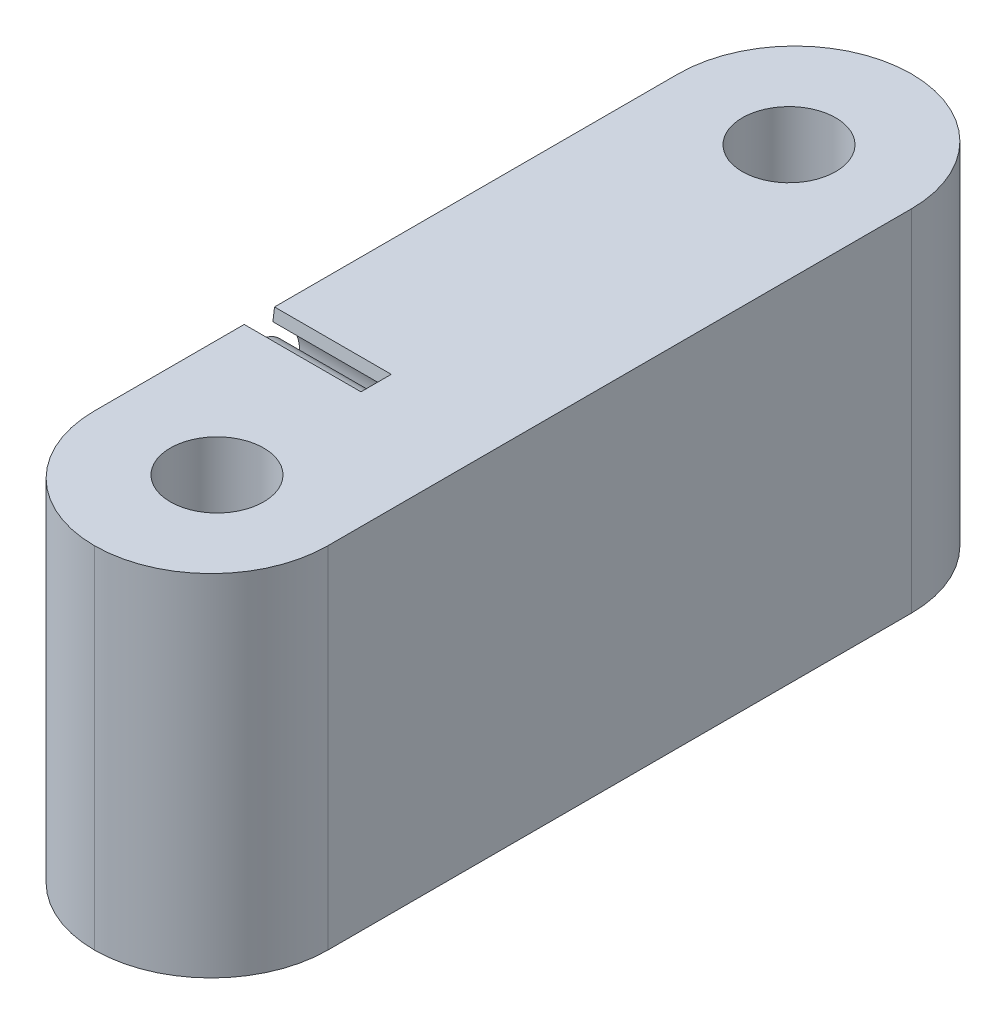
ISO-10303-21;
HEADER;
FILE_DESCRIPTION(('STEP AP214'),'2;1');
FILE_NAME('part.step','',(''),(''),'','','');
FILE_SCHEMA(('AUTOMOTIVE_DESIGN { 1 0 10303 214 1 1 1 1 }'));
ENDSEC;
DATA;
#1=APPLICATION_CONTEXT('core data for automotive mechanical design processes');
#2=APPLICATION_PROTOCOL_DEFINITION('international standard','automotive_design',2000,#1);
#3=PRODUCT_CONTEXT('',#1,'mechanical');
#4=PRODUCT('Part','Part','',(#3));
#5=PRODUCT_RELATED_PRODUCT_CATEGORY('part','',(#4));
#6=PRODUCT_DEFINITION_FORMATION('','',#4);
#7=PRODUCT_DEFINITION_CONTEXT('part definition',#1,'design');
#8=PRODUCT_DEFINITION('design','',#6,#7);
#9=PRODUCT_DEFINITION_SHAPE('','',#8);
#10=(LENGTH_UNIT() NAMED_UNIT(*) SI_UNIT(.MILLI.,.METRE.));
#11=(NAMED_UNIT(*) PLANE_ANGLE_UNIT() SI_UNIT($,.RADIAN.));
#12=(NAMED_UNIT(*) SI_UNIT($,.STERADIAN.) SOLID_ANGLE_UNIT());
#13=UNCERTAINTY_MEASURE_WITH_UNIT(LENGTH_MEASURE(1.E-05),#10,'distance_accuracy_value','');
#14=(GEOMETRIC_REPRESENTATION_CONTEXT(3) GLOBAL_UNCERTAINTY_ASSIGNED_CONTEXT((#13)) GLOBAL_UNIT_ASSIGNED_CONTEXT((#10,
#11,#12)) REPRESENTATION_CONTEXT('',''));
#15=CARTESIAN_POINT('',(0.,0.,0.));
#16=DIRECTION('',(0.,0.,1.));
#17=DIRECTION('',(1.,0.,0.));
#18=AXIS2_PLACEMENT_3D('',#15,#16,#17);
#19=CARTESIAN_POINT('',(-3.52238805970147,30.,-29.7611940298508));
#20=DIRECTION('',(1.,0.,0.));
#21=DIRECTION('',(0.,0.,-1.));
#22=AXIS2_PLACEMENT_3D('',#19,#20,#21);
#23=PLANE('',#22);
#24=DIRECTION('',(0.,0.,1.));
#25=VECTOR('',#24,1.);
#26=CARTESIAN_POINT('',(-3.52238805970147,30.,-29.7611940298508));
#27=LINE('',#26,#25);
#28=CARTESIAN_POINT('',(-3.52238805970147,30.,-19.7611940298507));
#29=VERTEX_POINT('',#28);
#30=CARTESIAN_POINT('',(-3.52238805970146,30.,14.812554190196));
#31=VERTEX_POINT('',#30);
#32=EDGE_CURVE('E196',#29,#31,#27,.T.);
#33=ORIENTED_EDGE('',*,*,#32,.F.);
#34=DIRECTION('',(0.,-1.,0.));
#35=VECTOR('',#34,1.);
#36=CARTESIAN_POINT('',(-3.52238805970147,30.,-19.7611940298507));
#37=LINE('',#36,#35);
#38=CARTESIAN_POINT('',(-3.52238805970147,0.,-19.7611940298507));
#39=VERTEX_POINT('',#38);
#40=EDGE_CURVE('E212',#29,#39,#37,.T.);
#41=ORIENTED_EDGE('',*,*,#40,.T.);
#42=DIRECTION('',(0.,0.,1.));
#43=VECTOR('',#42,1.);
#44=CARTESIAN_POINT('',(-3.52238805970147,0.,-29.7611940298508));
#45=LINE('',#44,#43);
#46=CARTESIAN_POINT('',(-3.52238805970146,0.,30.2388059701493));
#47=VERTEX_POINT('',#46);
#48=EDGE_CURVE('E184',#39,#47,#45,.T.);
#49=ORIENTED_EDGE('',*,*,#48,.T.);
#50=DIRECTION('',(0.,-1.,0.));
#51=VECTOR('',#50,1.);
#52=CARTESIAN_POINT('',(-3.52238805970146,30.,30.2388059701493));
#53=LINE('',#52,#51);
#54=CARTESIAN_POINT('',(-3.52238805970146,30.,30.2388059701493));
#55=VERTEX_POINT('',#54);
#56=EDGE_CURVE('E203',#47,#55,#53,.F.);
#57=ORIENTED_EDGE('',*,*,#56,.T.);
#58=CARTESIAN_POINT('',(-3.52238805970146,30.,17.4075983617578));
#59=VERTEX_POINT('',#58);
#60=EDGE_CURVE('E200',#59,#55,#27,.T.);
#61=ORIENTED_EDGE('',*,*,#60,.F.);
#62=DIRECTION('',(0.,-0.998274373174996,-0.0587220219514735));
#63=VECTOR('',#62,1.);
#64=CARTESIAN_POINT('',(-3.52238805970146,-0.916997145344465,15.5889514708551));
#65=LINE('',#64,#63);
#66=CARTESIAN_POINT('',(-3.52238805970146,28.9802150072761,17.3476110092446));
#67=VERTEX_POINT('',#66);
#68=EDGE_CURVE('E164',#59,#67,#65,.T.);
#69=ORIENTED_EDGE('',*,*,#68,.T.);
#70=CARTESIAN_POINT('',(-3.52238805970146,25.6865831727299,16.1635547021105));
#71=DIRECTION('',(-1.,0.,0.));
#72=DIRECTION('',(0.,0.,1.));
#73=AXIS2_PLACEMENT_3D('',#70,#71,#72);
#74=CIRCLE('',#73,3.5);
#75=CARTESIAN_POINT('',(-3.52238805970146,28.9694464253818,14.9499613334784));
#76=VERTEX_POINT('',#75);
#77=EDGE_CURVE('E160',#76,#67,#74,.T.);
#78=ORIENTED_EDGE('',*,*,#77,.F.);
#79=DIRECTION('',(0.,0.991227900682634,-0.132163720091024));
#80=VECTOR('',#79,1.);
#81=CARTESIAN_POINT('',(-3.52238805970146,2.46452674980748,18.4839506235552));
#82=LINE('',#81,#80);
#83=EDGE_CURVE('E124',#76,#31,#82,.T.);
#84=ORIENTED_EDGE('',*,*,#83,.T.);
#85=EDGE_LOOP('',(#33,#41,#49,#57,#61,#69,#78,#84));
#86=FACE_BOUND('',#85,.T.);
#87=ADVANCED_FACE('F38',(#86),#23,.F.);
#88=CARTESIAN_POINT('',(0.,30.,0.));
#89=DIRECTION('',(0.,1.,0.));
#90=DIRECTION('',(0.,0.,1.));
#91=AXIS2_PLACEMENT_3D('',#88,#89,#90);
#92=PLANE('',#91);
#93=CARTESIAN_POINT('',(6.47761194029853,30.,-19.2611940298507));
#94=DIRECTION('',(0.,1.,0.));
#95=DIRECTION('',(0.,0.,1.));
#96=AXIS2_PLACEMENT_3D('',#93,#94,#95);
#97=CIRCLE('',#96,4.);
#98=CARTESIAN_POINT('',(6.47761194029853,30.,-15.2611940298507));
#99=VERTEX_POINT('',#98);
#100=EDGE_CURVE('E185',#99,#99,#97,.T.);
#101=ORIENTED_EDGE('',*,*,#100,.F.);
#102=EDGE_LOOP('',(#101));
#103=FACE_BOUND('',#102,.T.);
#104=CARTESIAN_POINT('',(6.47761194029853,30.,29.7388059701493));
#105=DIRECTION('',(0.,1.,0.));
#106=DIRECTION('',(0.,0.,1.));
#107=AXIS2_PLACEMENT_3D('',#104,#105,#106);
#108=CIRCLE('',#107,4.);
#109=CARTESIAN_POINT('',(6.47761194029853,30.,33.7388059701493));
#110=VERTEX_POINT('',#109);
#111=EDGE_CURVE('E174',#110,#110,#108,.T.);
#112=ORIENTED_EDGE('',*,*,#111,.F.);
#113=EDGE_LOOP('',(#112));
#114=FACE_BOUND('',#113,.T.);
#115=CARTESIAN_POINT('',(6.47761194029853,30.,-19.7611940298507));
#116=DIRECTION('',(0.,1.,0.));
#117=DIRECTION('',(0.,0.,1.));
#118=AXIS2_PLACEMENT_3D('',#115,#116,#117);
#119=CIRCLE('',#118,10.);
#120=CARTESIAN_POINT('',(16.4776119402985,30.,-19.7611940298507));
#121=VERTEX_POINT('',#120);
#122=CARTESIAN_POINT('',(6.47761194029853,30.,-29.7611940298508));
#123=VERTEX_POINT('',#122);
#124=EDGE_CURVE('E56',#121,#123,#119,.T.);
#125=ORIENTED_EDGE('',*,*,#124,.T.);
#126=CARTESIAN_POINT('',(6.47761194029853,30.,-19.7611940298507));
#127=DIRECTION('',(0.,1.,0.));
#128=DIRECTION('',(0.,0.,1.));
#129=AXIS2_PLACEMENT_3D('',#126,#127,#128);
#130=CIRCLE('',#129,10.);
#131=EDGE_CURVE('E236',#123,#29,#130,.T.);
#132=ORIENTED_EDGE('',*,*,#131,.T.);
#133=ORIENTED_EDGE('',*,*,#32,.T.);
#134=DIRECTION('',(-1.,0.,0.));
#135=VECTOR('',#134,1.);
#136=CARTESIAN_POINT('',(6.47761194029853,30.,14.812554190196));
#137=LINE('',#136,#135);
#138=CARTESIAN_POINT('',(6.47761194029853,30.,14.812554190196));
#139=VERTEX_POINT('',#138);
#140=EDGE_CURVE('E171',#139,#31,#137,.T.);
#141=ORIENTED_EDGE('',*,*,#140,.F.);
#142=DIRECTION('',(0.,0.,-1.));
#143=VECTOR('',#142,1.);
#144=CARTESIAN_POINT('',(6.47761194029853,30.,0.));
#145=LINE('',#144,#143);
#146=CARTESIAN_POINT('',(6.47761194029853,30.,17.4075983617578));
#147=VERTEX_POINT('',#146);
#148=EDGE_CURVE('E139',#147,#139,#145,.T.);
#149=ORIENTED_EDGE('',*,*,#148,.F.);
#150=DIRECTION('',(-1.,0.,0.));
#151=VECTOR('',#150,1.);
#152=CARTESIAN_POINT('',(6.47761194029853,30.,17.4075983617578));
#153=LINE('',#152,#151);
#154=EDGE_CURVE('E175',#147,#59,#153,.T.);
#155=ORIENTED_EDGE('',*,*,#154,.T.);
#156=ORIENTED_EDGE('',*,*,#60,.T.);
#157=CARTESIAN_POINT('',(6.47761194029854,30.,30.2388059701493));
#158=DIRECTION('',(0.,1.,0.));
#159=DIRECTION('',(0.,0.,1.));
#160=AXIS2_PLACEMENT_3D('',#157,#158,#159);
#161=CIRCLE('',#160,10.);
#162=CARTESIAN_POINT('',(6.47761194029854,30.,40.2388059701493));
#163=VERTEX_POINT('',#162);
#164=EDGE_CURVE('E228',#55,#163,#161,.T.);
#165=ORIENTED_EDGE('',*,*,#164,.T.);
#166=CARTESIAN_POINT('',(6.47761194029854,30.,30.2388059701493));
#167=DIRECTION('',(0.,1.,0.));
#168=DIRECTION('',(0.,0.,1.));
#169=AXIS2_PLACEMENT_3D('',#166,#167,#168);
#170=CIRCLE('',#169,10.);
#171=CARTESIAN_POINT('',(16.4776119402985,30.,30.2388059701493));
#172=VERTEX_POINT('',#171);
#173=EDGE_CURVE('E231',#163,#172,#170,.T.);
#174=ORIENTED_EDGE('',*,*,#173,.T.);
#175=DIRECTION('',(0.,0.,-1.));
#176=VECTOR('',#175,1.);
#177=CARTESIAN_POINT('',(16.4776119402985,30.,-29.7611940298508));
#178=LINE('',#177,#176);
#179=EDGE_CURVE('E199',#172,#121,#178,.T.);
#180=ORIENTED_EDGE('',*,*,#179,.T.);
#181=EDGE_LOOP('',(#125,#132,#133,#141,#149,#155,#156,#165,#174,#180));
#182=FACE_BOUND('',#181,.T.);
#183=ADVANCED_FACE('F280',(#103,#114,#182),#92,.T.);
#184=CARTESIAN_POINT('',(16.4776119402985,30.,-29.7611940298508));
#185=DIRECTION('',(-1.,0.,0.));
#186=DIRECTION('',(0.,0.,1.));
#187=AXIS2_PLACEMENT_3D('',#184,#185,#186);
#188=PLANE('',#187);
#189=DIRECTION('',(0.,0.,-1.));
#190=VECTOR('',#189,1.);
#191=CARTESIAN_POINT('',(16.4776119402985,0.,-29.7611940298508));
#192=LINE('',#191,#190);
#193=CARTESIAN_POINT('',(16.4776119402985,0.,30.2388059701493));
#194=VERTEX_POINT('',#193);
#195=CARTESIAN_POINT('',(16.4776119402985,0.,-19.7611940298507));
#196=VERTEX_POINT('',#195);
#197=EDGE_CURVE('E207',#194,#196,#192,.T.);
#198=ORIENTED_EDGE('',*,*,#197,.T.);
#199=DIRECTION('',(0.,-1.,0.));
#200=VECTOR('',#199,1.);
#201=CARTESIAN_POINT('',(16.4776119402985,30.,-19.7611940298507));
#202=LINE('',#201,#200);
#203=EDGE_CURVE('E11',#196,#121,#202,.F.);
#204=ORIENTED_EDGE('',*,*,#203,.T.);
#205=ORIENTED_EDGE('',*,*,#179,.F.);
#206=DIRECTION('',(0.,-1.,0.));
#207=VECTOR('',#206,1.);
#208=CARTESIAN_POINT('',(16.4776119402985,30.,30.2388059701493));
#209=LINE('',#208,#207);
#210=EDGE_CURVE('E48',#172,#194,#209,.T.);
#211=ORIENTED_EDGE('',*,*,#210,.T.);
#212=EDGE_LOOP('',(#198,#204,#205,#211));
#213=FACE_BOUND('',#212,.T.);
#214=ADVANCED_FACE('F284',(#213),#188,.F.);
#215=CARTESIAN_POINT('',(0.,0.,0.));
#216=DIRECTION('',(0.,1.,0.));
#217=DIRECTION('',(0.,0.,1.));
#218=AXIS2_PLACEMENT_3D('',#215,#216,#217);
#219=PLANE('',#218);
#220=ORIENTED_EDGE('',*,*,#48,.F.);
#221=CARTESIAN_POINT('',(6.47761194029853,0.,-19.7611940298507));
#222=DIRECTION('',(0.,1.,0.));
#223=DIRECTION('',(0.,0.,1.));
#224=AXIS2_PLACEMENT_3D('',#221,#222,#223);
#225=CIRCLE('',#224,10.);
#226=CARTESIAN_POINT('',(6.47761194029853,0.,-29.7611940298508));
#227=VERTEX_POINT('',#226);
#228=EDGE_CURVE('E225',#39,#227,#225,.F.);
#229=ORIENTED_EDGE('',*,*,#228,.T.);
#230=CARTESIAN_POINT('',(6.47761194029853,0.,-19.7611940298507));
#231=DIRECTION('',(0.,1.,0.));
#232=DIRECTION('',(0.,0.,1.));
#233=AXIS2_PLACEMENT_3D('',#230,#231,#232);
#234=CIRCLE('',#233,10.);
#235=EDGE_CURVE('E222',#227,#196,#234,.F.);
#236=ORIENTED_EDGE('',*,*,#235,.T.);
#237=ORIENTED_EDGE('',*,*,#197,.F.);
#238=CARTESIAN_POINT('',(6.47761194029854,0.,30.2388059701493));
#239=DIRECTION('',(0.,1.,0.));
#240=DIRECTION('',(0.,0.,1.));
#241=AXIS2_PLACEMENT_3D('',#238,#239,#240);
#242=CIRCLE('',#241,10.);
#243=CARTESIAN_POINT('',(6.47761194029854,0.,40.2388059701493));
#244=VERTEX_POINT('',#243);
#245=EDGE_CURVE('E219',#194,#244,#242,.F.);
#246=ORIENTED_EDGE('',*,*,#245,.T.);
#247=CARTESIAN_POINT('',(6.47761194029854,0.,30.2388059701493));
#248=DIRECTION('',(0.,1.,0.));
#249=DIRECTION('',(0.,0.,1.));
#250=AXIS2_PLACEMENT_3D('',#247,#248,#249);
#251=CIRCLE('',#250,10.);
#252=EDGE_CURVE('E216',#244,#47,#251,.F.);
#253=ORIENTED_EDGE('',*,*,#252,.T.);
#254=EDGE_LOOP('',(#220,#229,#236,#237,#246,#253));
#255=FACE_BOUND('',#254,.T.);
#256=ADVANCED_FACE('F258',(#255),#219,.F.);
#257=CARTESIAN_POINT('',(6.47761194029853,10.,29.7388059701493));
#258=DIRECTION('',(0.,1.,0.));
#259=DIRECTION('',(0.,0.,1.));
#260=AXIS2_PLACEMENT_3D('',#257,#258,#259);
#261=CYLINDRICAL_SURFACE('',#260,4.);
#262=CARTESIAN_POINT('',(6.47761194029853,10.,29.7388059701493));
#263=DIRECTION('',(0.,1.,0.));
#264=DIRECTION('',(0.,0.,1.));
#265=AXIS2_PLACEMENT_3D('',#262,#263,#264);
#266=CIRCLE('',#265,4.);
#267=CARTESIAN_POINT('',(6.47761194029853,10.,33.7388059701493));
#268=VERTEX_POINT('',#267);
#269=EDGE_CURVE('E189',#268,#268,#266,.T.);
#270=ORIENTED_EDGE('',*,*,#269,.F.);
#271=EDGE_LOOP('',(#270));
#272=FACE_BOUND('',#271,.T.);
#273=ORIENTED_EDGE('',*,*,#111,.T.);
#274=EDGE_LOOP('',(#273));
#275=FACE_BOUND('',#274,.T.);
#276=ADVANCED_FACE('F291',(#272,#275),#261,.F.);
#277=CARTESIAN_POINT('',(6.47761194029853,10.,29.7388059701493));
#278=DIRECTION('',(0.,1.,0.));
#279=DIRECTION('',(0.,0.,1.));
#280=AXIS2_PLACEMENT_3D('',#277,#278,#279);
#281=PLANE('',#280);
#282=ORIENTED_EDGE('',*,*,#269,.T.);
#283=EDGE_LOOP('',(#282));
#284=FACE_BOUND('',#283,.T.);
#285=ADVANCED_FACE('F295',(#284),#281,.T.);
#286=CARTESIAN_POINT('',(6.47761194029853,10.,-19.2611940298507));
#287=DIRECTION('',(0.,1.,0.));
#288=DIRECTION('',(0.,0.,1.));
#289=AXIS2_PLACEMENT_3D('',#286,#287,#288);
#290=CYLINDRICAL_SURFACE('',#289,4.);
#291=CARTESIAN_POINT('',(6.47761194029853,10.,-19.2611940298507));
#292=DIRECTION('',(0.,1.,0.));
#293=DIRECTION('',(0.,0.,1.));
#294=AXIS2_PLACEMENT_3D('',#291,#292,#293);
#295=CIRCLE('',#294,4.);
#296=CARTESIAN_POINT('',(6.47761194029853,10.,-15.2611940298507));
#297=VERTEX_POINT('',#296);
#298=EDGE_CURVE('E180',#297,#297,#295,.T.);
#299=ORIENTED_EDGE('',*,*,#298,.F.);
#300=EDGE_LOOP('',(#299));
#301=FACE_BOUND('',#300,.T.);
#302=ORIENTED_EDGE('',*,*,#100,.T.);
#303=EDGE_LOOP('',(#302));
#304=FACE_BOUND('',#303,.T.);
#305=ADVANCED_FACE('F299',(#301,#304),#290,.F.);
#306=CARTESIAN_POINT('',(6.47761194029853,10.,-19.2611940298507));
#307=DIRECTION('',(0.,1.,0.));
#308=DIRECTION('',(0.,0.,1.));
#309=AXIS2_PLACEMENT_3D('',#306,#307,#308);
#310=PLANE('',#309);
#311=ORIENTED_EDGE('',*,*,#298,.T.);
#312=EDGE_LOOP('',(#311));
#313=FACE_BOUND('',#312,.T.);
#314=ADVANCED_FACE('F303',(#313),#310,.T.);
#315=CARTESIAN_POINT('',(6.47761194029853,2.46452674980748,18.4839506235552));
#316=DIRECTION('',(0.,0.132163720091024,0.991227900682634));
#317=DIRECTION('',(0.,-0.991227900682634,0.132163720091024));
#318=AXIS2_PLACEMENT_3D('',#315,#316,#317);
#319=PLANE('',#318);
#320=ORIENTED_EDGE('',*,*,#83,.F.);
#321=DIRECTION('',(-1.,0.,0.));
#322=VECTOR('',#321,1.);
#323=CARTESIAN_POINT('',(6.47761194029853,28.9694464253818,14.9499613334784));
#324=LINE('',#323,#322);
#325=CARTESIAN_POINT('',(6.47761194029853,28.9694464253818,14.9499613334784));
#326=VERTEX_POINT('',#325);
#327=EDGE_CURVE('E117',#326,#76,#324,.T.);
#328=ORIENTED_EDGE('',*,*,#327,.F.);
#329=DIRECTION('',(0.,0.991227900682634,-0.132163720091024));
#330=VECTOR('',#329,1.);
#331=CARTESIAN_POINT('',(6.47761194029853,2.46452674980748,18.4839506235552));
#332=LINE('',#331,#330);
#333=EDGE_CURVE('E121',#326,#139,#332,.T.);
#334=ORIENTED_EDGE('',*,*,#333,.T.);
#335=ORIENTED_EDGE('',*,*,#140,.T.);
#336=EDGE_LOOP('',(#320,#328,#334,#335));
#337=FACE_BOUND('',#336,.T.);
#338=ADVANCED_FACE('F119',(#337),#319,.T.);
#339=CARTESIAN_POINT('',(6.47761194029853,-0.916997145344465,15.5889514708551));
#340=DIRECTION('',(0.,0.0587220219514735,-0.998274373174996));
#341=DIRECTION('',(0.,0.998274373174996,0.0587220219514735));
#342=AXIS2_PLACEMENT_3D('',#339,#340,#341);
#343=PLANE('',#342);
#344=ORIENTED_EDGE('',*,*,#68,.F.);
#345=ORIENTED_EDGE('',*,*,#154,.F.);
#346=DIRECTION('',(0.,-0.998274373174996,-0.0587220219514735));
#347=VECTOR('',#346,1.);
#348=CARTESIAN_POINT('',(6.47761194029853,-0.916997145344465,15.5889514708551));
#349=LINE('',#348,#347);
#350=CARTESIAN_POINT('',(6.47761194029853,28.9802150072761,17.3476110092446));
#351=VERTEX_POINT('',#350);
#352=EDGE_CURVE('E147',#147,#351,#349,.T.);
#353=ORIENTED_EDGE('',*,*,#352,.T.);
#354=DIRECTION('',(-1.,0.,0.));
#355=VECTOR('',#354,1.);
#356=CARTESIAN_POINT('',(6.47761194029853,28.9802150072761,17.3476110092446));
#357=LINE('',#356,#355);
#358=EDGE_CURVE('E130',#351,#67,#357,.T.);
#359=ORIENTED_EDGE('',*,*,#358,.T.);
#360=EDGE_LOOP('',(#344,#345,#353,#359));
#361=FACE_BOUND('',#360,.T.);
#362=ADVANCED_FACE('F310',(#361),#343,.T.);
#363=CARTESIAN_POINT('',(6.47761194029853,25.6865831727299,16.1635547021105));
#364=DIRECTION('',(-1.,0.,0.));
#365=DIRECTION('',(0.,0.,1.));
#366=AXIS2_PLACEMENT_3D('',#363,#364,#365);
#367=CYLINDRICAL_SURFACE('',#366,3.5);
#368=ORIENTED_EDGE('',*,*,#77,.T.);
#369=ORIENTED_EDGE('',*,*,#358,.F.);
#370=CARTESIAN_POINT('',(6.47761194029853,25.6865831727299,16.1635547021105));
#371=DIRECTION('',(-1.,0.,0.));
#372=DIRECTION('',(0.,0.,1.));
#373=AXIS2_PLACEMENT_3D('',#370,#371,#372);
#374=CIRCLE('',#373,3.5);
#375=EDGE_CURVE('E137',#326,#351,#374,.T.);
#376=ORIENTED_EDGE('',*,*,#375,.F.);
#377=ORIENTED_EDGE('',*,*,#327,.T.);
#378=EDGE_LOOP('',(#368,#369,#376,#377));
#379=FACE_BOUND('',#378,.T.);
#380=ADVANCED_FACE('F145',(#379),#367,.F.);
#381=CARTESIAN_POINT('',(6.47761194029853,25.6865831727299,16.1635547021105));
#382=DIRECTION('',(-1.,0.,0.));
#383=DIRECTION('',(0.,0.,1.));
#384=AXIS2_PLACEMENT_3D('',#381,#382,#383);
#385=CYLINDRICAL_SURFACE('',#384,2.5);
#386=CARTESIAN_POINT('',(6.47761194029853,25.6865831727299,16.1635547021105));
#387=DIRECTION('',(-1.,0.,0.));
#388=DIRECTION('',(0.,0.,1.));
#389=AXIS2_PLACEMENT_3D('',#386,#387,#388);
#390=CIRCLE('',#389,2.5);
#391=CARTESIAN_POINT('',(6.47761194029853,25.6865831727299,18.6635547021105));
#392=VERTEX_POINT('',#391);
#393=EDGE_CURVE('E131',#392,#392,#390,.T.);
#394=ORIENTED_EDGE('',*,*,#393,.T.);
#395=EDGE_LOOP('',(#394));
#396=FACE_BOUND('',#395,.T.);
#397=CARTESIAN_POINT('',(-3.52238805970146,25.6865831727299,16.1635547021105));
#398=DIRECTION('',(-1.,0.,0.));
#399=DIRECTION('',(0.,0.,1.));
#400=AXIS2_PLACEMENT_3D('',#397,#398,#399);
#401=CIRCLE('',#400,2.5);
#402=CARTESIAN_POINT('',(-3.52238805970146,25.6865831727299,18.6635547021105));
#403=VERTEX_POINT('',#402);
#404=EDGE_CURVE('E142',#403,#403,#401,.T.);
#405=ORIENTED_EDGE('',*,*,#404,.F.);
#406=EDGE_LOOP('',(#405));
#407=FACE_BOUND('',#406,.T.);
#408=ADVANCED_FACE('F313',(#396,#407),#385,.T.);
#409=CARTESIAN_POINT('',(6.47761194029853,0.,0.));
#410=DIRECTION('',(-1.,0.,0.));
#411=DIRECTION('',(0.,0.,1.));
#412=AXIS2_PLACEMENT_3D('',#409,#410,#411);
#413=PLANE('',#412);
#414=ORIENTED_EDGE('',*,*,#333,.F.);
#415=ORIENTED_EDGE('',*,*,#375,.T.);
#416=ORIENTED_EDGE('',*,*,#352,.F.);
#417=ORIENTED_EDGE('',*,*,#148,.T.);
#418=EDGE_LOOP('',(#414,#415,#416,#417));
#419=FACE_BOUND('',#418,.T.);
#420=ORIENTED_EDGE('',*,*,#393,.F.);
#421=EDGE_LOOP('',(#420));
#422=FACE_BOUND('',#421,.T.);
#423=ADVANCED_FACE('F135',(#419,#422),#413,.T.);
#424=ORIENTED_EDGE('',*,*,#404,.T.);
#425=EDGE_LOOP('',(#424));
#426=FACE_BOUND('',#425,.T.);
#427=ADVANCED_FACE('F270',(#426),#23,.F.);
#428=CARTESIAN_POINT('',(6.47761194029853,30.,-19.7611940298507));
#429=DIRECTION('',(0.,-1.,0.));
#430=DIRECTION('',(0.,0.,-1.));
#431=AXIS2_PLACEMENT_3D('',#428,#429,#430);
#432=CYLINDRICAL_SURFACE('',#431,10.);
#433=DIRECTION('',(0.,-1.,0.));
#434=VECTOR('',#433,1.);
#435=CARTESIAN_POINT('',(6.47761194029853,30.,-29.7611940298508));
#436=LINE('',#435,#434);
#437=EDGE_CURVE('E161',#123,#227,#436,.T.);
#438=ORIENTED_EDGE('',*,*,#437,.F.);
#439=ORIENTED_EDGE('',*,*,#124,.F.);
#440=ORIENTED_EDGE('',*,*,#203,.F.);
#441=ORIENTED_EDGE('',*,*,#235,.F.);
#442=EDGE_LOOP('',(#438,#439,#440,#441));
#443=FACE_BOUND('',#442,.T.);
#444=ADVANCED_FACE('F268',(#443),#432,.T.);
#445=CARTESIAN_POINT('',(6.47761194029853,30.,-19.7611940298507));
#446=DIRECTION('',(0.,-1.,0.));
#447=DIRECTION('',(0.,0.,-1.));
#448=AXIS2_PLACEMENT_3D('',#445,#446,#447);
#449=CYLINDRICAL_SURFACE('',#448,10.);
#450=ORIENTED_EDGE('',*,*,#131,.F.);
#451=ORIENTED_EDGE('',*,*,#437,.T.);
#452=ORIENTED_EDGE('',*,*,#228,.F.);
#453=ORIENTED_EDGE('',*,*,#40,.F.);
#454=EDGE_LOOP('',(#450,#451,#452,#453));
#455=FACE_BOUND('',#454,.T.);
#456=ADVANCED_FACE('F265',(#455),#449,.T.);
#457=CARTESIAN_POINT('',(6.47761194029854,30.,30.2388059701493));
#458=DIRECTION('',(0.,-1.,0.));
#459=DIRECTION('',(0.,0.,-1.));
#460=AXIS2_PLACEMENT_3D('',#457,#458,#459);
#461=CYLINDRICAL_SURFACE('',#460,10.);
#462=DIRECTION('',(0.,-1.,0.));
#463=VECTOR('',#462,1.);
#464=CARTESIAN_POINT('',(6.47761194029854,30.,40.2388059701493));
#465=LINE('',#464,#463);
#466=EDGE_CURVE('E42',#163,#244,#465,.T.);
#467=ORIENTED_EDGE('',*,*,#466,.F.);
#468=ORIENTED_EDGE('',*,*,#164,.F.);
#469=ORIENTED_EDGE('',*,*,#56,.F.);
#470=ORIENTED_EDGE('',*,*,#252,.F.);
#471=EDGE_LOOP('',(#467,#468,#469,#470));
#472=FACE_BOUND('',#471,.T.);
#473=ADVANCED_FACE('F40',(#472),#461,.T.);
#474=CARTESIAN_POINT('',(6.47761194029854,30.,30.2388059701493));
#475=DIRECTION('',(0.,-1.,0.));
#476=DIRECTION('',(0.,0.,-1.));
#477=AXIS2_PLACEMENT_3D('',#474,#475,#476);
#478=CYLINDRICAL_SURFACE('',#477,10.);
#479=ORIENTED_EDGE('',*,*,#173,.F.);
#480=ORIENTED_EDGE('',*,*,#466,.T.);
#481=ORIENTED_EDGE('',*,*,#245,.F.);
#482=ORIENTED_EDGE('',*,*,#210,.F.);
#483=EDGE_LOOP('',(#479,#480,#481,#482));
#484=FACE_BOUND('',#483,.T.);
#485=ADVANCED_FACE('F250',(#484),#478,.T.);
#486=CLOSED_SHELL('',(#87,#183,#214,#256,#276,#285,#305,#314,#338,#362,#380,#408,#423,#427,#444,
#456,#473,#485));
#487=MANIFOLD_SOLID_BREP('B2',#486);
#488=ADVANCED_BREP_SHAPE_REPRESENTATION('',(#18,#487),#14);
#489=SHAPE_DEFINITION_REPRESENTATION(#9,#488);
ENDSEC;
END-ISO-10303-21;
